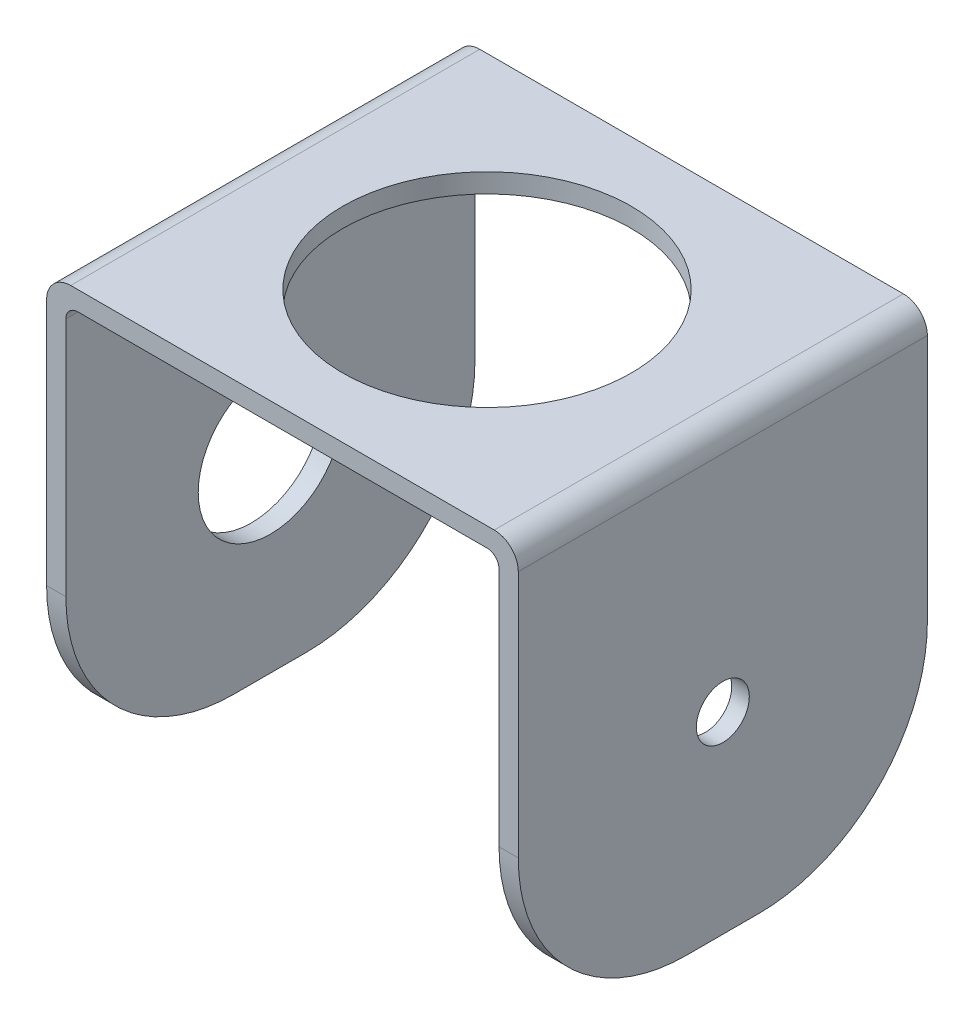
ISO-10303-21;
HEADER;
FILE_DESCRIPTION(('STEP AP214'),'2;1');
FILE_NAME('part.step','',(''),(''),'','','');
FILE_SCHEMA(('AUTOMOTIVE_DESIGN { 1 0 10303 214 1 1 1 1 }'));
ENDSEC;
DATA;
#1=APPLICATION_CONTEXT('core data for automotive mechanical design processes');
#2=APPLICATION_PROTOCOL_DEFINITION('international standard','automotive_design',2000,#1);
#3=PRODUCT_CONTEXT('',#1,'mechanical');
#4=PRODUCT('Part','Part','',(#3));
#5=PRODUCT_RELATED_PRODUCT_CATEGORY('part','',(#4));
#6=PRODUCT_DEFINITION_FORMATION('','',#4);
#7=PRODUCT_DEFINITION_CONTEXT('part definition',#1,'design');
#8=PRODUCT_DEFINITION('design','',#6,#7);
#9=PRODUCT_DEFINITION_SHAPE('','',#8);
#10=(LENGTH_UNIT() NAMED_UNIT(*) SI_UNIT(.MILLI.,.METRE.));
#11=(NAMED_UNIT(*) PLANE_ANGLE_UNIT() SI_UNIT($,.RADIAN.));
#12=(NAMED_UNIT(*) SI_UNIT($,.STERADIAN.) SOLID_ANGLE_UNIT());
#13=UNCERTAINTY_MEASURE_WITH_UNIT(LENGTH_MEASURE(1.E-05),#10,'distance_accuracy_value','');
#14=(GEOMETRIC_REPRESENTATION_CONTEXT(3) GLOBAL_UNCERTAINTY_ASSIGNED_CONTEXT((#13)) GLOBAL_UNIT_ASSIGNED_CONTEXT((#10,
#11,#12)) REPRESENTATION_CONTEXT('',''));
#15=CARTESIAN_POINT('',(0.,0.,0.));
#16=DIRECTION('',(0.,0.,1.));
#17=DIRECTION('',(1.,0.,0.));
#18=AXIS2_PLACEMENT_3D('',#15,#16,#17);
#19=CARTESIAN_POINT('',(-188.,-95.,85.));
#20=DIRECTION('',(1.,0.,0.));
#21=DIRECTION('',(0.,1.,0.));
#22=AXIS2_PLACEMENT_3D('',#19,#20,#21);
#23=CYLINDRICAL_SURFACE('',#22,11.);
#24=CARTESIAN_POINT('',(8.00000000000001,-95.,85.));
#25=DIRECTION('',(-1.,0.,0.));
#26=DIRECTION('',(0.,-1.,0.));
#27=AXIS2_PLACEMENT_3D('',#24,#25,#26);
#28=CIRCLE('',#27,11.);
#29=CARTESIAN_POINT('',(8.00000000000001,-106.,85.));
#30=VERTEX_POINT('',#29);
#31=EDGE_CURVE('E470',#30,#30,#28,.T.);
#32=ORIENTED_EDGE('',*,*,#31,.F.);
#33=EDGE_LOOP('',(#32));
#34=FACE_BOUND('',#33,.T.);
#35=CARTESIAN_POINT('',(0.700000000000006,-95.,85.));
#36=DIRECTION('',(-1.,0.,0.));
#37=DIRECTION('',(0.,-1.,0.));
#38=AXIS2_PLACEMENT_3D('',#35,#36,#37);
#39=CIRCLE('',#38,11.);
#40=CARTESIAN_POINT('',(0.700000000000008,-106.,85.));
#41=VERTEX_POINT('',#40);
#42=EDGE_CURVE('E38',#41,#41,#39,.F.);
#43=ORIENTED_EDGE('',*,*,#42,.F.);
#44=EDGE_LOOP('',(#43));
#45=FACE_BOUND('',#44,.T.);
#46=ADVANCED_FACE('F34',(#34,#45),#23,.F.);
#47=CARTESIAN_POINT('',(-180.,0.,170.));
#48=DIRECTION('',(-1.,0.,0.));
#49=DIRECTION('',(0.,0.,1.));
#50=AXIS2_PLACEMENT_3D('',#47,#48,#49);
#51=PLANE('',#50);
#52=CARTESIAN_POINT('',(-180.,-95.,85.));
#53=DIRECTION('',(-1.,0.,0.));
#54=DIRECTION('',(0.,0.,1.));
#55=AXIS2_PLACEMENT_3D('',#52,#53,#54);
#56=CIRCLE('',#55,30.);
#57=CARTESIAN_POINT('',(-180.,-95.,115.));
#58=VERTEX_POINT('',#57);
#59=EDGE_CURVE('E467',#58,#58,#56,.T.);
#60=ORIENTED_EDGE('',*,*,#59,.T.);
#61=EDGE_LOOP('',(#60));
#62=FACE_BOUND('',#61,.T.);
#63=DIRECTION('',(0.,1.,0.));
#64=VECTOR('',#63,1.);
#65=CARTESIAN_POINT('',(-180.,0.,0.));
#66=LINE('',#65,#64);
#67=CARTESIAN_POINT('',(-180.,-105.,0.));
#68=VERTEX_POINT('',#67);
#69=CARTESIAN_POINT('',(-180.,-5.,0.));
#70=VERTEX_POINT('',#69);
#71=EDGE_CURVE('E195',#68,#70,#66,.T.);
#72=ORIENTED_EDGE('',*,*,#71,.T.);
#73=DIRECTION('',(0.,0.,-1.));
#74=VECTOR('',#73,1.);
#75=CARTESIAN_POINT('',(-180.,-5.,170.));
#76=LINE('',#75,#74);
#77=CARTESIAN_POINT('',(-180.,-5.,170.));
#78=VERTEX_POINT('',#77);
#79=EDGE_CURVE('E175',#70,#78,#76,.F.);
#80=ORIENTED_EDGE('',*,*,#79,.T.);
#81=DIRECTION('',(0.,1.,0.));
#82=VECTOR('',#81,1.);
#83=CARTESIAN_POINT('',(-180.,0.,170.));
#84=LINE('',#83,#82);
#85=CARTESIAN_POINT('',(-180.,-105.,170.));
#86=VERTEX_POINT('',#85);
#87=EDGE_CURVE('E166',#86,#78,#84,.T.);
#88=ORIENTED_EDGE('',*,*,#87,.F.);
#89=CARTESIAN_POINT('',(-180.,-105.,100.));
#90=DIRECTION('',(-1.,0.,0.));
#91=DIRECTION('',(0.,0.,1.));
#92=AXIS2_PLACEMENT_3D('',#89,#90,#91);
#93=CIRCLE('',#92,70.);
#94=CARTESIAN_POINT('',(-180.,-175.,100.));
#95=VERTEX_POINT('',#94);
#96=EDGE_CURVE('E151',#86,#95,#93,.F.);
#97=ORIENTED_EDGE('',*,*,#96,.T.);
#98=DIRECTION('',(0.,0.,-1.));
#99=VECTOR('',#98,1.);
#100=CARTESIAN_POINT('',(-180.,-175.,170.));
#101=LINE('',#100,#99);
#102=CARTESIAN_POINT('',(-180.,-175.,70.));
#103=VERTEX_POINT('',#102);
#104=EDGE_CURVE('E194',#95,#103,#101,.T.);
#105=ORIENTED_EDGE('',*,*,#104,.T.);
#106=CARTESIAN_POINT('',(-180.,-105.,70.));
#107=DIRECTION('',(-1.,0.,0.));
#108=DIRECTION('',(0.,0.,1.));
#109=AXIS2_PLACEMENT_3D('',#106,#107,#108);
#110=CIRCLE('',#109,70.);
#111=EDGE_CURVE('E162',#103,#68,#110,.F.);
#112=ORIENTED_EDGE('',*,*,#111,.T.);
#113=EDGE_LOOP('',(#72,#80,#88,#97,#105,#112));
#114=FACE_BOUND('',#113,.T.);
#115=ADVANCED_FACE('F173',(#62,#114),#51,.F.);
#116=CARTESIAN_POINT('',(-180.,0.,170.));
#117=DIRECTION('',(0.,1.,0.));
#118=DIRECTION('',(0.,0.,1.));
#119=AXIS2_PLACEMENT_3D('',#116,#117,#118);
#120=PLANE('',#119);
#121=CARTESIAN_POINT('',(-90.,0.,85.));
#122=DIRECTION('',(0.,1.,0.));
#123=DIRECTION('',(0.,0.,1.));
#124=AXIS2_PLACEMENT_3D('',#121,#122,#123);
#125=CIRCLE('',#124,60.);
#126=CARTESIAN_POINT('',(-150.,0.,85.));
#127=VERTEX_POINT('',#126);
#128=EDGE_CURVE('E185',#127,#127,#125,.T.);
#129=ORIENTED_EDGE('',*,*,#128,.T.);
#130=EDGE_LOOP('',(#129));
#131=FACE_BOUND('',#130,.T.);
#132=DIRECTION('',(1.,0.,0.));
#133=VECTOR('',#132,1.);
#134=CARTESIAN_POINT('',(-180.,0.,170.));
#135=LINE('',#134,#133);
#136=CARTESIAN_POINT('',(-175.,0.,170.));
#137=VERTEX_POINT('',#136);
#138=CARTESIAN_POINT('',(-5.00000000000006,0.,170.));
#139=VERTEX_POINT('',#138);
#140=EDGE_CURVE('E176',#137,#139,#135,.T.);
#141=ORIENTED_EDGE('',*,*,#140,.F.);
#142=DIRECTION('',(0.,0.,-1.));
#143=VECTOR('',#142,1.);
#144=CARTESIAN_POINT('',(-175.,0.,0.));
#145=LINE('',#144,#143);
#146=CARTESIAN_POINT('',(-175.,0.,0.));
#147=VERTEX_POINT('',#146);
#148=EDGE_CURVE('E248',#137,#147,#145,.T.);
#149=ORIENTED_EDGE('',*,*,#148,.T.);
#150=DIRECTION('',(1.,0.,0.));
#151=VECTOR('',#150,1.);
#152=CARTESIAN_POINT('',(-180.,0.,0.));
#153=LINE('',#152,#151);
#154=CARTESIAN_POINT('',(-5.00000000000006,0.,0.));
#155=VERTEX_POINT('',#154);
#156=EDGE_CURVE('E197',#147,#155,#153,.T.);
#157=ORIENTED_EDGE('',*,*,#156,.T.);
#158=DIRECTION('',(0.,0.,-1.));
#159=VECTOR('',#158,1.);
#160=CARTESIAN_POINT('',(-5.,0.,170.));
#161=LINE('',#160,#159);
#162=EDGE_CURVE('E246',#155,#139,#161,.F.);
#163=ORIENTED_EDGE('',*,*,#162,.T.);
#164=EDGE_LOOP('',(#141,#149,#157,#163));
#165=FACE_BOUND('',#164,.T.);
#166=ADVANCED_FACE('F313',(#131,#165),#120,.F.);
#167=CARTESIAN_POINT('',(0.,0.,170.));
#168=DIRECTION('',(1.,0.,0.));
#169=DIRECTION('',(0.,1.,0.));
#170=AXIS2_PLACEMENT_3D('',#167,#168,#169);
#171=PLANE('',#170);
#172=CARTESIAN_POINT('',(0.,-95.,85.));
#173=DIRECTION('',(-1.,0.,0.));
#174=DIRECTION('',(0.,-1.,0.));
#175=AXIS2_PLACEMENT_3D('',#172,#173,#174);
#176=CIRCLE('',#175,13.);
#177=CARTESIAN_POINT('',(0.,-108.,85.));
#178=VERTEX_POINT('',#177);
#179=EDGE_CURVE('E460',#178,#178,#176,.T.);
#180=ORIENTED_EDGE('',*,*,#179,.F.);
#181=EDGE_LOOP('',(#180));
#182=FACE_BOUND('',#181,.T.);
#183=DIRECTION('',(0.,-1.,0.));
#184=VECTOR('',#183,1.);
#185=CARTESIAN_POINT('',(0.,0.,170.));
#186=LINE('',#185,#184);
#187=CARTESIAN_POINT('',(0.,-5.,170.));
#188=VERTEX_POINT('',#187);
#189=CARTESIAN_POINT('',(0.,-105.,170.));
#190=VERTEX_POINT('',#189);
#191=EDGE_CURVE('E180',#188,#190,#186,.T.);
#192=ORIENTED_EDGE('',*,*,#191,.F.);
#193=DIRECTION('',(0.,0.,-1.));
#194=VECTOR('',#193,1.);
#195=CARTESIAN_POINT('',(0.,-5.,0.));
#196=LINE('',#195,#194);
#197=CARTESIAN_POINT('',(0.,-5.,0.));
#198=VERTEX_POINT('',#197);
#199=EDGE_CURVE('E252',#188,#198,#196,.T.);
#200=ORIENTED_EDGE('',*,*,#199,.T.);
#201=DIRECTION('',(0.,-1.,0.));
#202=VECTOR('',#201,1.);
#203=CARTESIAN_POINT('',(0.,0.,0.));
#204=LINE('',#203,#202);
#205=CARTESIAN_POINT('',(0.,-105.,0.));
#206=VERTEX_POINT('',#205);
#207=EDGE_CURVE('E200',#198,#206,#204,.T.);
#208=ORIENTED_EDGE('',*,*,#207,.T.);
#209=CARTESIAN_POINT('',(0.,-105.,70.));
#210=DIRECTION('',(1.,0.,0.));
#211=DIRECTION('',(0.,1.,0.));
#212=AXIS2_PLACEMENT_3D('',#209,#210,#211);
#213=CIRCLE('',#212,70.);
#214=CARTESIAN_POINT('',(0.,-175.,70.));
#215=VERTEX_POINT('',#214);
#216=EDGE_CURVE('E244',#206,#215,#213,.F.);
#217=ORIENTED_EDGE('',*,*,#216,.T.);
#218=DIRECTION('',(0.,0.,-1.));
#219=VECTOR('',#218,1.);
#220=CARTESIAN_POINT('',(0.,-175.,170.));
#221=LINE('',#220,#219);
#222=CARTESIAN_POINT('',(0.,-175.,100.));
#223=VERTEX_POINT('',#222);
#224=EDGE_CURVE('E213',#223,#215,#221,.T.);
#225=ORIENTED_EDGE('',*,*,#224,.F.);
#226=CARTESIAN_POINT('',(0.,-105.,100.));
#227=DIRECTION('',(1.,0.,0.));
#228=DIRECTION('',(0.,1.,0.));
#229=AXIS2_PLACEMENT_3D('',#226,#227,#228);
#230=CIRCLE('',#229,70.);
#231=EDGE_CURVE('E241',#223,#190,#230,.F.);
#232=ORIENTED_EDGE('',*,*,#231,.T.);
#233=EDGE_LOOP('',(#192,#200,#208,#217,#225,#232));
#234=FACE_BOUND('',#233,.T.);
#235=ADVANCED_FACE('F300',(#182,#234),#171,.F.);
#236=CARTESIAN_POINT('',(0.,-175.,170.));
#237=DIRECTION('',(0.,1.,0.));
#238=DIRECTION('',(0.,0.,1.));
#239=AXIS2_PLACEMENT_3D('',#236,#237,#238);
#240=PLANE('',#239);
#241=ORIENTED_EDGE('',*,*,#224,.T.);
#242=DIRECTION('',(1.,0.,0.));
#243=VECTOR('',#242,1.);
#244=CARTESIAN_POINT('',(8.00000000000002,-175.,70.));
#245=LINE('',#244,#243);
#246=CARTESIAN_POINT('',(8.00000000000002,-175.,70.));
#247=VERTEX_POINT('',#246);
#248=EDGE_CURVE('E234',#215,#247,#245,.T.);
#249=ORIENTED_EDGE('',*,*,#248,.T.);
#250=DIRECTION('',(0.,0.,-1.));
#251=VECTOR('',#250,1.);
#252=CARTESIAN_POINT('',(8.00000000000002,-175.,170.));
#253=LINE('',#252,#251);
#254=CARTESIAN_POINT('',(8.00000000000002,-175.,100.));
#255=VERTEX_POINT('',#254);
#256=EDGE_CURVE('E210',#255,#247,#253,.T.);
#257=ORIENTED_EDGE('',*,*,#256,.F.);
#258=DIRECTION('',(1.,0.,0.));
#259=VECTOR('',#258,1.);
#260=CARTESIAN_POINT('',(0.,-175.,100.));
#261=LINE('',#260,#259);
#262=EDGE_CURVE('E232',#255,#223,#261,.F.);
#263=ORIENTED_EDGE('',*,*,#262,.T.);
#264=EDGE_LOOP('',(#241,#249,#257,#263));
#265=FACE_BOUND('',#264,.T.);
#266=ADVANCED_FACE('F294',(#265),#240,.F.);
#267=CARTESIAN_POINT('',(8.00000000000002,-175.,170.));
#268=DIRECTION('',(-1.,0.,0.));
#269=DIRECTION('',(0.,-1.,0.));
#270=AXIS2_PLACEMENT_3D('',#267,#268,#269);
#271=PLANE('',#270);
#272=ORIENTED_EDGE('',*,*,#31,.T.);
#273=EDGE_LOOP('',(#272));
#274=FACE_BOUND('',#273,.T.);
#275=DIRECTION('',(0.,1.,0.));
#276=VECTOR('',#275,1.);
#277=CARTESIAN_POINT('',(8.00000000000002,-175.,0.));
#278=LINE('',#277,#276);
#279=CARTESIAN_POINT('',(8.00000000000002,-105.,0.));
#280=VERTEX_POINT('',#279);
#281=CARTESIAN_POINT('',(8.00000000000001,-1.99999999999997,0.));
#282=VERTEX_POINT('',#281);
#283=EDGE_CURVE('E202',#280,#282,#278,.T.);
#284=ORIENTED_EDGE('',*,*,#283,.T.);
#285=DIRECTION('',(0.,0.,-1.));
#286=VECTOR('',#285,1.);
#287=CARTESIAN_POINT('',(8.00000000000001,-1.99999999999997,170.));
#288=LINE('',#287,#286);
#289=CARTESIAN_POINT('',(8.00000000000001,-1.99999999999997,170.));
#290=VERTEX_POINT('',#289);
#291=EDGE_CURVE('E58',#282,#290,#288,.F.);
#292=ORIENTED_EDGE('',*,*,#291,.T.);
#293=DIRECTION('',(0.,1.,0.));
#294=VECTOR('',#293,1.);
#295=CARTESIAN_POINT('',(8.00000000000002,-175.,170.));
#296=LINE('',#295,#294);
#297=CARTESIAN_POINT('',(8.00000000000002,-105.,170.));
#298=VERTEX_POINT('',#297);
#299=EDGE_CURVE('E189',#298,#290,#296,.T.);
#300=ORIENTED_EDGE('',*,*,#299,.F.);
#301=CARTESIAN_POINT('',(8.00000000000002,-105.,100.));
#302=DIRECTION('',(-1.,0.,0.));
#303=DIRECTION('',(0.,-1.,0.));
#304=AXIS2_PLACEMENT_3D('',#301,#302,#303);
#305=CIRCLE('',#304,70.);
#306=EDGE_CURVE('E237',#298,#255,#305,.F.);
#307=ORIENTED_EDGE('',*,*,#306,.T.);
#308=ORIENTED_EDGE('',*,*,#256,.T.);
#309=CARTESIAN_POINT('',(8.00000000000002,-105.,70.));
#310=DIRECTION('',(-1.,0.,0.));
#311=DIRECTION('',(0.,-1.,0.));
#312=AXIS2_PLACEMENT_3D('',#309,#310,#311);
#313=CIRCLE('',#312,70.);
#314=EDGE_CURVE('E239',#247,#280,#313,.F.);
#315=ORIENTED_EDGE('',*,*,#314,.T.);
#316=EDGE_LOOP('',(#284,#292,#300,#307,#308,#315));
#317=FACE_BOUND('',#316,.T.);
#318=ADVANCED_FACE('F287',(#274,#317),#271,.F.);
#319=CARTESIAN_POINT('',(-180.,7.99999999999998,170.));
#320=DIRECTION('',(0.,-1.,0.));
#321=DIRECTION('',(1.,0.,0.));
#322=AXIS2_PLACEMENT_3D('',#319,#320,#321);
#323=PLANE('',#322);
#324=CARTESIAN_POINT('',(-90.,8.00000000000001,85.));
#325=DIRECTION('',(0.,1.,0.));
#326=DIRECTION('',(-1.,0.,0.));
#327=AXIS2_PLACEMENT_3D('',#324,#325,#326);
#328=CIRCLE('',#327,60.);
#329=CARTESIAN_POINT('',(-150.,8.00000000000004,85.));
#330=VERTEX_POINT('',#329);
#331=EDGE_CURVE('E472',#330,#330,#328,.T.);
#332=ORIENTED_EDGE('',*,*,#331,.F.);
#333=EDGE_LOOP('',(#332));
#334=FACE_BOUND('',#333,.T.);
#335=DIRECTION('',(-1.,0.,0.));
#336=VECTOR('',#335,1.);
#337=CARTESIAN_POINT('',(8.00000000000001,8.00000000000001,170.));
#338=LINE('',#337,#336);
#339=CARTESIAN_POINT('',(-1.99999999999998,8.00000000000001,170.));
#340=VERTEX_POINT('',#339);
#341=CARTESIAN_POINT('',(-178.,7.99999999999998,170.));
#342=VERTEX_POINT('',#341);
#343=EDGE_CURVE('E191',#340,#342,#338,.T.);
#344=ORIENTED_EDGE('',*,*,#343,.F.);
#345=DIRECTION('',(0.,0.,-1.));
#346=VECTOR('',#345,1.);
#347=CARTESIAN_POINT('',(-1.99999999999997,8.00000000000002,170.));
#348=LINE('',#347,#346);
#349=CARTESIAN_POINT('',(-1.99999999999997,8.00000000000002,0.));
#350=VERTEX_POINT('',#349);
#351=EDGE_CURVE('E265',#340,#350,#348,.T.);
#352=ORIENTED_EDGE('',*,*,#351,.T.);
#353=DIRECTION('',(-1.,0.,0.));
#354=VECTOR('',#353,1.);
#355=CARTESIAN_POINT('',(-180.,7.99999999999998,0.));
#356=LINE('',#355,#354);
#357=CARTESIAN_POINT('',(-178.,7.99999999999998,0.));
#358=VERTEX_POINT('',#357);
#359=EDGE_CURVE('E182',#350,#358,#356,.T.);
#360=ORIENTED_EDGE('',*,*,#359,.T.);
#361=DIRECTION('',(0.,0.,-1.));
#362=VECTOR('',#361,1.);
#363=CARTESIAN_POINT('',(-178.,7.99999999999998,170.));
#364=LINE('',#363,#362);
#365=EDGE_CURVE('E263',#358,#342,#364,.F.);
#366=ORIENTED_EDGE('',*,*,#365,.T.);
#367=EDGE_LOOP('',(#344,#352,#360,#366));
#368=FACE_BOUND('',#367,.T.);
#369=ADVANCED_FACE('F279',(#334,#368),#323,.F.);
#370=CARTESIAN_POINT('',(-188.,7.99999999999998,170.));
#371=DIRECTION('',(1.,0.,0.));
#372=DIRECTION('',(0.,1.,0.));
#373=AXIS2_PLACEMENT_3D('',#370,#371,#372);
#374=PLANE('',#373);
#375=CARTESIAN_POINT('',(-188.,-95.,85.));
#376=DIRECTION('',(-1.,0.,0.));
#377=DIRECTION('',(0.,-1.,0.));
#378=AXIS2_PLACEMENT_3D('',#375,#376,#377);
#379=CIRCLE('',#378,30.);
#380=CARTESIAN_POINT('',(-188.,-125.,85.));
#381=VERTEX_POINT('',#380);
#382=EDGE_CURVE('E464',#381,#381,#379,.T.);
#383=ORIENTED_EDGE('',*,*,#382,.F.);
#384=EDGE_LOOP('',(#383));
#385=FACE_BOUND('',#384,.T.);
#386=DIRECTION('',(0.,-1.,0.));
#387=VECTOR('',#386,1.);
#388=CARTESIAN_POINT('',(-188.,7.99999999999998,170.));
#389=LINE('',#388,#387);
#390=CARTESIAN_POINT('',(-188.,-2.00000000000002,170.));
#391=VERTEX_POINT('',#390);
#392=CARTESIAN_POINT('',(-188.,-105.,170.));
#393=VERTEX_POINT('',#392);
#394=EDGE_CURVE('E168',#391,#393,#389,.T.);
#395=ORIENTED_EDGE('',*,*,#394,.F.);
#396=DIRECTION('',(0.,0.,-1.));
#397=VECTOR('',#396,1.);
#398=CARTESIAN_POINT('',(-188.,-2.00000000000002,170.));
#399=LINE('',#398,#397);
#400=CARTESIAN_POINT('',(-188.,-2.00000000000002,0.));
#401=VERTEX_POINT('',#400);
#402=EDGE_CURVE('E11',#391,#401,#399,.T.);
#403=ORIENTED_EDGE('',*,*,#402,.T.);
#404=DIRECTION('',(0.,-1.,0.));
#405=VECTOR('',#404,1.);
#406=CARTESIAN_POINT('',(-188.,7.99999999999998,0.));
#407=LINE('',#406,#405);
#408=CARTESIAN_POINT('',(-188.,-105.,0.));
#409=VERTEX_POINT('',#408);
#410=EDGE_CURVE('E177',#401,#409,#407,.T.);
#411=ORIENTED_EDGE('',*,*,#410,.T.);
#412=CARTESIAN_POINT('',(-188.,-105.,70.));
#413=DIRECTION('',(1.,0.,0.));
#414=DIRECTION('',(0.,1.,0.));
#415=AXIS2_PLACEMENT_3D('',#412,#413,#414);
#416=CIRCLE('',#415,70.);
#417=CARTESIAN_POINT('',(-188.,-175.,70.));
#418=VERTEX_POINT('',#417);
#419=EDGE_CURVE('E222',#409,#418,#416,.F.);
#420=ORIENTED_EDGE('',*,*,#419,.T.);
#421=DIRECTION('',(0.,0.,-1.));
#422=VECTOR('',#421,1.);
#423=CARTESIAN_POINT('',(-188.,-175.,170.));
#424=LINE('',#423,#422);
#425=CARTESIAN_POINT('',(-188.,-175.,100.));
#426=VERTEX_POINT('',#425);
#427=EDGE_CURVE('E207',#426,#418,#424,.T.);
#428=ORIENTED_EDGE('',*,*,#427,.F.);
#429=CARTESIAN_POINT('',(-188.,-105.,100.));
#430=DIRECTION('',(1.,0.,0.));
#431=DIRECTION('',(0.,1.,0.));
#432=AXIS2_PLACEMENT_3D('',#429,#430,#431);
#433=CIRCLE('',#432,70.);
#434=EDGE_CURVE('E224',#426,#393,#433,.F.);
#435=ORIENTED_EDGE('',*,*,#434,.T.);
#436=EDGE_LOOP('',(#395,#403,#411,#420,#428,#435));
#437=FACE_BOUND('',#436,.T.);
#438=ADVANCED_FACE('F327',(#385,#437),#374,.F.);
#439=CARTESIAN_POINT('',(-180.,-175.,170.));
#440=DIRECTION('',(0.,1.,0.));
#441=DIRECTION('',(0.,0.,1.));
#442=AXIS2_PLACEMENT_3D('',#439,#440,#441);
#443=PLANE('',#442);
#444=ORIENTED_EDGE('',*,*,#104,.F.);
#445=DIRECTION('',(1.,0.,0.));
#446=VECTOR('',#445,1.);
#447=CARTESIAN_POINT('',(-180.,-175.,100.));
#448=LINE('',#447,#446);
#449=EDGE_CURVE('E156',#95,#426,#448,.F.);
#450=ORIENTED_EDGE('',*,*,#449,.T.);
#451=ORIENTED_EDGE('',*,*,#427,.T.);
#452=DIRECTION('',(1.,0.,0.));
#453=VECTOR('',#452,1.);
#454=CARTESIAN_POINT('',(-180.,-175.,70.));
#455=LINE('',#454,#453);
#456=EDGE_CURVE('E161',#418,#103,#455,.T.);
#457=ORIENTED_EDGE('',*,*,#456,.T.);
#458=EDGE_LOOP('',(#444,#450,#451,#457));
#459=FACE_BOUND('',#458,.T.);
#460=ADVANCED_FACE('F324',(#459),#443,.F.);
#461=CARTESIAN_POINT('',(0.,0.,170.));
#462=DIRECTION('',(0.,0.,-1.));
#463=DIRECTION('',(-1.,0.,0.));
#464=AXIS2_PLACEMENT_3D('',#461,#462,#463);
#465=PLANE('',#464);
#466=ORIENTED_EDGE('',*,*,#299,.T.);
#467=CARTESIAN_POINT('',(-1.99999999999997,-1.99999999999998,170.));
#468=DIRECTION('',(0.,0.,-1.));
#469=DIRECTION('',(-1.,0.,0.));
#470=AXIS2_PLACEMENT_3D('',#467,#468,#469);
#471=CIRCLE('',#470,10.);
#472=EDGE_CURVE('E43',#290,#340,#471,.F.);
#473=ORIENTED_EDGE('',*,*,#472,.T.);
#474=ORIENTED_EDGE('',*,*,#343,.T.);
#475=CARTESIAN_POINT('',(-178.,-2.00000000000002,170.));
#476=DIRECTION('',(0.,0.,-1.));
#477=DIRECTION('',(-1.,0.,0.));
#478=AXIS2_PLACEMENT_3D('',#475,#476,#477);
#479=CIRCLE('',#478,10.);
#480=EDGE_CURVE('E50',#342,#391,#479,.F.);
#481=ORIENTED_EDGE('',*,*,#480,.T.);
#482=ORIENTED_EDGE('',*,*,#394,.T.);
#483=DIRECTION('',(1.,0.,0.));
#484=VECTOR('',#483,1.);
#485=CARTESIAN_POINT('',(0.,-105.,170.));
#486=LINE('',#485,#484);
#487=EDGE_CURVE('E155',#393,#86,#486,.T.);
#488=ORIENTED_EDGE('',*,*,#487,.T.);
#489=ORIENTED_EDGE('',*,*,#87,.T.);
#490=CARTESIAN_POINT('',(-175.,-5.,170.));
#491=DIRECTION('',(0.,0.,-1.));
#492=DIRECTION('',(-1.,0.,0.));
#493=AXIS2_PLACEMENT_3D('',#490,#491,#492);
#494=CIRCLE('',#493,5.);
#495=EDGE_CURVE('E257',#78,#137,#494,.T.);
#496=ORIENTED_EDGE('',*,*,#495,.T.);
#497=ORIENTED_EDGE('',*,*,#140,.T.);
#498=CARTESIAN_POINT('',(-5.,-5.,170.));
#499=DIRECTION('',(0.,0.,-1.));
#500=DIRECTION('',(-1.,0.,0.));
#501=AXIS2_PLACEMENT_3D('',#498,#499,#500);
#502=CIRCLE('',#501,5.);
#503=EDGE_CURVE('E261',#139,#188,#502,.T.);
#504=ORIENTED_EDGE('',*,*,#503,.T.);
#505=ORIENTED_EDGE('',*,*,#191,.T.);
#506=DIRECTION('',(1.,0.,0.));
#507=VECTOR('',#506,1.);
#508=CARTESIAN_POINT('',(0.,-105.,170.));
#509=LINE('',#508,#507);
#510=EDGE_CURVE('E170',#190,#298,#509,.T.);
#511=ORIENTED_EDGE('',*,*,#510,.T.);
#512=EDGE_LOOP('',(#466,#473,#474,#481,#482,#488,#489,#496,#497,#504,#505,#511));
#513=FACE_BOUND('',#512,.T.);
#514=ADVANCED_FACE('F165',(#513),#465,.F.);
#515=CARTESIAN_POINT('',(0.,0.,0.));
#516=DIRECTION('',(0.,0.,-1.));
#517=DIRECTION('',(-1.,0.,0.));
#518=AXIS2_PLACEMENT_3D('',#515,#516,#517);
#519=PLANE('',#518);
#520=ORIENTED_EDGE('',*,*,#359,.F.);
#521=CARTESIAN_POINT('',(-1.99999999999997,-1.99999999999998,0.));
#522=DIRECTION('',(0.,0.,-1.));
#523=DIRECTION('',(-1.,0.,0.));
#524=AXIS2_PLACEMENT_3D('',#521,#522,#523);
#525=CIRCLE('',#524,10.);
#526=EDGE_CURVE('E270',#350,#282,#525,.T.);
#527=ORIENTED_EDGE('',*,*,#526,.T.);
#528=ORIENTED_EDGE('',*,*,#283,.F.);
#529=DIRECTION('',(1.,0.,0.));
#530=VECTOR('',#529,1.);
#531=CARTESIAN_POINT('',(0.,-105.,0.));
#532=LINE('',#531,#530);
#533=EDGE_CURVE('E226',#280,#206,#532,.F.);
#534=ORIENTED_EDGE('',*,*,#533,.T.);
#535=ORIENTED_EDGE('',*,*,#207,.F.);
#536=CARTESIAN_POINT('',(-5.,-5.,0.));
#537=DIRECTION('',(0.,0.,-1.));
#538=DIRECTION('',(-1.,0.,0.));
#539=AXIS2_PLACEMENT_3D('',#536,#537,#538);
#540=CIRCLE('',#539,5.);
#541=EDGE_CURVE('E259',#198,#155,#540,.F.);
#542=ORIENTED_EDGE('',*,*,#541,.T.);
#543=ORIENTED_EDGE('',*,*,#156,.F.);
#544=CARTESIAN_POINT('',(-175.,-5.,0.));
#545=DIRECTION('',(0.,0.,-1.));
#546=DIRECTION('',(-1.,0.,0.));
#547=AXIS2_PLACEMENT_3D('',#544,#545,#546);
#548=CIRCLE('',#547,5.);
#549=EDGE_CURVE('E255',#147,#70,#548,.F.);
#550=ORIENTED_EDGE('',*,*,#549,.T.);
#551=ORIENTED_EDGE('',*,*,#71,.F.);
#552=DIRECTION('',(1.,0.,0.));
#553=VECTOR('',#552,1.);
#554=CARTESIAN_POINT('',(-188.,-105.,0.));
#555=LINE('',#554,#553);
#556=EDGE_CURVE('E229',#68,#409,#555,.F.);
#557=ORIENTED_EDGE('',*,*,#556,.T.);
#558=ORIENTED_EDGE('',*,*,#410,.F.);
#559=CARTESIAN_POINT('',(-178.,-2.00000000000002,0.));
#560=DIRECTION('',(0.,0.,-1.));
#561=DIRECTION('',(-1.,0.,0.));
#562=AXIS2_PLACEMENT_3D('',#559,#560,#561);
#563=CIRCLE('',#562,10.);
#564=EDGE_CURVE('E268',#401,#358,#563,.T.);
#565=ORIENTED_EDGE('',*,*,#564,.T.);
#566=EDGE_LOOP('',(#520,#527,#528,#534,#535,#542,#543,#550,#551,#557,#558,#565));
#567=FACE_BOUND('',#566,.T.);
#568=ADVANCED_FACE('F285',(#567),#519,.T.);
#569=CARTESIAN_POINT('',(-90.,-172.,85.));
#570=DIRECTION('',(0.,1.,0.));
#571=DIRECTION('',(-1.,0.,0.));
#572=AXIS2_PLACEMENT_3D('',#569,#570,#571);
#573=CYLINDRICAL_SURFACE('',#572,60.);
#574=CARTESIAN_POINT('',(-150.,8.00000000000004,85.));
#575=CARTESIAN_POINT('',(-150.,7.9166666666667,85.));
#576=CARTESIAN_POINT('',(-150.,7.83333333333337,85.));
#577=CARTESIAN_POINT('',(-150.,7.6666666666667,85.));
#578=CARTESIAN_POINT('',(-150.,7.58333333333337,85.));
#579=CARTESIAN_POINT('',(-150.,7.4166666666667,85.));
#580=CARTESIAN_POINT('',(-150.,7.33333333333337,85.));
#581=CARTESIAN_POINT('',(-150.,7.1666666666667,85.));
#582=CARTESIAN_POINT('',(-150.,7.08333333333337,85.));
#583=CARTESIAN_POINT('',(-150.,6.9166666666667,85.));
#584=CARTESIAN_POINT('',(-150.,6.83333333333337,85.));
#585=CARTESIAN_POINT('',(-150.,6.6666666666667,85.));
#586=CARTESIAN_POINT('',(-150.,6.58333333333337,85.));
#587=CARTESIAN_POINT('',(-150.,6.4166666666667,85.));
#588=CARTESIAN_POINT('',(-150.,6.33333333333337,85.));
#589=CARTESIAN_POINT('',(-150.,6.1666666666667,85.));
#590=CARTESIAN_POINT('',(-150.,6.08333333333337,85.));
#591=CARTESIAN_POINT('',(-150.,5.91666666666669,85.));
#592=CARTESIAN_POINT('',(-150.,5.83333333333335,85.));
#593=CARTESIAN_POINT('',(-150.,5.66666666666667,85.));
#594=CARTESIAN_POINT('',(-150.,5.58333333333334,85.));
#595=CARTESIAN_POINT('',(-150.,5.41666666666667,85.));
#596=CARTESIAN_POINT('',(-150.,5.33333333333334,85.));
#597=CARTESIAN_POINT('',(-150.,5.16666666666667,85.));
#598=CARTESIAN_POINT('',(-150.,5.08333333333334,85.));
#599=CARTESIAN_POINT('',(-150.,4.91666666666667,85.));
#600=CARTESIAN_POINT('',(-150.,4.83333333333334,85.));
#601=CARTESIAN_POINT('',(-150.,4.66666666666667,85.));
#602=CARTESIAN_POINT('',(-150.,4.58333333333334,85.));
#603=CARTESIAN_POINT('',(-150.,4.41666666666667,85.));
#604=CARTESIAN_POINT('',(-150.,4.33333333333334,85.));
#605=CARTESIAN_POINT('',(-150.,4.16666666666667,85.));
#606=CARTESIAN_POINT('',(-150.,4.08333333333334,85.));
#607=CARTESIAN_POINT('',(-150.,3.91666666666667,85.));
#608=CARTESIAN_POINT('',(-150.,3.83333333333334,85.));
#609=CARTESIAN_POINT('',(-150.,3.66666666666667,85.));
#610=CARTESIAN_POINT('',(-150.,3.58333333333334,85.));
#611=CARTESIAN_POINT('',(-150.,3.41666666666667,85.));
#612=CARTESIAN_POINT('',(-150.,3.33333333333334,85.));
#613=CARTESIAN_POINT('',(-150.,3.16666666666667,85.));
#614=CARTESIAN_POINT('',(-150.,3.08333333333334,85.));
#615=CARTESIAN_POINT('',(-150.,2.91666666666667,85.));
#616=CARTESIAN_POINT('',(-150.,2.83333333333334,85.));
#617=CARTESIAN_POINT('',(-150.,2.66666666666667,85.));
#618=CARTESIAN_POINT('',(-150.,2.58333333333334,85.));
#619=CARTESIAN_POINT('',(-150.,2.41666666666667,85.));
#620=CARTESIAN_POINT('',(-150.,2.33333333333334,85.));
#621=CARTESIAN_POINT('',(-150.,2.16666666666666,85.));
#622=CARTESIAN_POINT('',(-150.,2.08333333333332,85.));
#623=CARTESIAN_POINT('',(-150.,1.91666666666664,85.));
#624=CARTESIAN_POINT('',(-150.,1.83333333333331,85.));
#625=CARTESIAN_POINT('',(-150.,1.66666666666664,85.));
#626=CARTESIAN_POINT('',(-150.,1.58333333333331,85.));
#627=CARTESIAN_POINT('',(-150.,1.41666666666664,85.));
#628=CARTESIAN_POINT('',(-150.,1.33333333333331,85.));
#629=CARTESIAN_POINT('',(-150.,1.16666666666664,85.));
#630=CARTESIAN_POINT('',(-150.,1.08333333333331,85.));
#631=CARTESIAN_POINT('',(-150.,0.91666666666664,85.));
#632=CARTESIAN_POINT('',(-150.,0.833333333333306,85.));
#633=CARTESIAN_POINT('',(-150.,0.66666666666664,85.));
#634=CARTESIAN_POINT('',(-150.,0.583333333333306,85.));
#635=CARTESIAN_POINT('',(-150.,0.416666666666639,85.));
#636=CARTESIAN_POINT('',(-150.,0.333333333333306,85.));
#637=CARTESIAN_POINT('',(-150.,0.166666666666639,85.));
#638=CARTESIAN_POINT('',(-150.,0.0833333333333056,85.));
#639=CARTESIAN_POINT('',(-150.,0.,85.));
#640=B_SPLINE_CURVE_WITH_KNOTS('',3,(#574,#575,#576,#577,#578,#579,#580,#581,#582,#583,#584,
#585,#586,#587,#588,#589,#590,#591,#592,#593,#594,#595,#596,#597,#598,#599,#600,#601,#602,#603,
#604,#605,#606,#607,#608,#609,#610,#611,#612,#613,#614,#615,#616,#617,#618,#619,#620,#621,#622,
#623,#624,#625,#626,#627,#628,#629,#630,#631,#632,#633,#634,#635,#636,#637,#638,#639),
.UNSPECIFIED.,.F.,.F.,(4,2,2,2,2,2,2,2,2,2,2,2,2,2,2,2,2,2,2,2,2,2,2,2,2,2,2,2,2,2,2,2,4),(0.,
0.25,0.5,0.750000000000001,1.,1.25,1.5,1.75,2.,2.25000000000003,2.50000000000003,
2.75000000000003,3.00000000000003,3.25000000000003,3.50000000000003,3.75000000000003,
4.00000000000003,4.25000000000003,4.50000000000003,4.75000000000003,5.00000000000003,
5.25000000000003,5.50000000000003,5.75000000000003,6.00000000000006,6.25000000000006,
6.50000000000006,6.75000000000006,7.00000000000006,7.25000000000006,7.50000000000006,
7.75000000000006,8.00000000000006),.UNSPECIFIED.);
#641=EDGE_CURVE('BSEAM354',#330,#127,#640,.T.);
#642=ORIENTED_EDGE('',*,*,#331,.T.);
#643=ORIENTED_EDGE('',*,*,#128,.F.);
#644=ORIENTED_EDGE('',*,*,#641,.T.);
#645=ORIENTED_EDGE('',*,*,#641,.F.);
#646=EDGE_LOOP('',(#642,#644,#643,#645));
#647=FACE_BOUND('',#646,.T.);
#648=ADVANCED_FACE('F354',(#647),#573,.F.);
#649=CARTESIAN_POINT('',(0.,-105.,100.));
#650=DIRECTION('',(1.,0.,0.));
#651=DIRECTION('',(0.,0.,-1.));
#652=AXIS2_PLACEMENT_3D('',#649,#650,#651);
#653=CYLINDRICAL_SURFACE('',#652,70.);
#654=ORIENTED_EDGE('',*,*,#434,.F.);
#655=ORIENTED_EDGE('',*,*,#449,.F.);
#656=ORIENTED_EDGE('',*,*,#96,.F.);
#657=ORIENTED_EDGE('',*,*,#487,.F.);
#658=EDGE_LOOP('',(#654,#655,#656,#657));
#659=FACE_BOUND('',#658,.T.);
#660=ADVANCED_FACE('F154',(#659),#653,.T.);
#661=CARTESIAN_POINT('',(-180.,-105.,70.));
#662=DIRECTION('',(-1.,0.,0.));
#663=DIRECTION('',(0.,0.,1.));
#664=AXIS2_PLACEMENT_3D('',#661,#662,#663);
#665=CYLINDRICAL_SURFACE('',#664,70.);
#666=ORIENTED_EDGE('',*,*,#419,.F.);
#667=ORIENTED_EDGE('',*,*,#556,.F.);
#668=ORIENTED_EDGE('',*,*,#111,.F.);
#669=ORIENTED_EDGE('',*,*,#456,.F.);
#670=EDGE_LOOP('',(#666,#667,#668,#669));
#671=FACE_BOUND('',#670,.T.);
#672=ADVANCED_FACE('F322',(#671),#665,.T.);
#673=CARTESIAN_POINT('',(0.,-105.,70.));
#674=DIRECTION('',(-1.,0.,0.));
#675=DIRECTION('',(0.,0.,1.));
#676=AXIS2_PLACEMENT_3D('',#673,#674,#675);
#677=CYLINDRICAL_SURFACE('',#676,70.);
#678=ORIENTED_EDGE('',*,*,#216,.F.);
#679=ORIENTED_EDGE('',*,*,#533,.F.);
#680=ORIENTED_EDGE('',*,*,#314,.F.);
#681=ORIENTED_EDGE('',*,*,#248,.F.);
#682=EDGE_LOOP('',(#678,#679,#680,#681));
#683=FACE_BOUND('',#682,.T.);
#684=ADVANCED_FACE('F292',(#683),#677,.T.);
#685=CARTESIAN_POINT('',(0.,-105.,100.));
#686=DIRECTION('',(1.,0.,0.));
#687=DIRECTION('',(0.,0.,-1.));
#688=AXIS2_PLACEMENT_3D('',#685,#686,#687);
#689=CYLINDRICAL_SURFACE('',#688,70.);
#690=ORIENTED_EDGE('',*,*,#231,.F.);
#691=ORIENTED_EDGE('',*,*,#262,.F.);
#692=ORIENTED_EDGE('',*,*,#306,.F.);
#693=ORIENTED_EDGE('',*,*,#510,.F.);
#694=EDGE_LOOP('',(#690,#691,#692,#693));
#695=FACE_BOUND('',#694,.T.);
#696=ADVANCED_FACE('F303',(#695),#689,.T.);
#697=CARTESIAN_POINT('',(-175.,-5.,170.));
#698=DIRECTION('',(0.,0.,1.));
#699=DIRECTION('',(1.,0.,0.));
#700=AXIS2_PLACEMENT_3D('',#697,#698,#699);
#701=CYLINDRICAL_SURFACE('',#700,5.);
#702=ORIENTED_EDGE('',*,*,#495,.F.);
#703=ORIENTED_EDGE('',*,*,#79,.F.);
#704=ORIENTED_EDGE('',*,*,#549,.F.);
#705=ORIENTED_EDGE('',*,*,#148,.F.);
#706=EDGE_LOOP('',(#702,#703,#704,#705));
#707=FACE_BOUND('',#706,.T.);
#708=ADVANCED_FACE('F316',(#707),#701,.F.);
#709=CARTESIAN_POINT('',(-5.,-5.,170.));
#710=DIRECTION('',(0.,0.,1.));
#711=DIRECTION('',(1.,0.,0.));
#712=AXIS2_PLACEMENT_3D('',#709,#710,#711);
#713=CYLINDRICAL_SURFACE('',#712,5.);
#714=ORIENTED_EDGE('',*,*,#503,.F.);
#715=ORIENTED_EDGE('',*,*,#162,.F.);
#716=ORIENTED_EDGE('',*,*,#541,.F.);
#717=ORIENTED_EDGE('',*,*,#199,.F.);
#718=EDGE_LOOP('',(#714,#715,#716,#717));
#719=FACE_BOUND('',#718,.T.);
#720=ADVANCED_FACE('F308',(#719),#713,.F.);
#721=CARTESIAN_POINT('',(-1.99999999999997,-1.99999999999998,170.));
#722=DIRECTION('',(0.,0.,-1.));
#723=DIRECTION('',(-1.,0.,0.));
#724=AXIS2_PLACEMENT_3D('',#721,#722,#723);
#725=CYLINDRICAL_SURFACE('',#724,10.);
#726=ORIENTED_EDGE('',*,*,#472,.F.);
#727=ORIENTED_EDGE('',*,*,#291,.F.);
#728=ORIENTED_EDGE('',*,*,#526,.F.);
#729=ORIENTED_EDGE('',*,*,#351,.F.);
#730=EDGE_LOOP('',(#726,#727,#728,#729));
#731=FACE_BOUND('',#730,.T.);
#732=ADVANCED_FACE('F282',(#731),#725,.T.);
#733=CARTESIAN_POINT('',(-178.,-2.00000000000002,170.));
#734=DIRECTION('',(0.,0.,-1.));
#735=DIRECTION('',(-1.,0.,0.));
#736=AXIS2_PLACEMENT_3D('',#733,#734,#735);
#737=CYLINDRICAL_SURFACE('',#736,10.);
#738=ORIENTED_EDGE('',*,*,#480,.F.);
#739=ORIENTED_EDGE('',*,*,#365,.F.);
#740=ORIENTED_EDGE('',*,*,#564,.F.);
#741=ORIENTED_EDGE('',*,*,#402,.F.);
#742=EDGE_LOOP('',(#738,#739,#740,#741));
#743=FACE_BOUND('',#742,.T.);
#744=ADVANCED_FACE('F36',(#743),#737,.T.);
#745=CARTESIAN_POINT('',(-149.,-95.,85.));
#746=DIRECTION('',(-1.,0.,0.));
#747=DIRECTION('',(0.,-1.,0.));
#748=AXIS2_PLACEMENT_3D('',#745,#746,#747);
#749=CYLINDRICAL_SURFACE('',#748,30.);
#750=ORIENTED_EDGE('',*,*,#382,.T.);
#751=EDGE_LOOP('',(#750));
#752=FACE_BOUND('',#751,.T.);
#753=ORIENTED_EDGE('',*,*,#59,.F.);
#754=EDGE_LOOP('',(#753));
#755=FACE_BOUND('',#754,.T.);
#756=ADVANCED_FACE('F332',(#752,#755),#749,.F.);
#757=CARTESIAN_POINT('',(0.700000000000012,-95.,85.));
#758=DIRECTION('',(-1.,0.,0.));
#759=DIRECTION('',(0.,-1.,0.));
#760=AXIS2_PLACEMENT_3D('',#757,#758,#759);
#761=PLANE('',#760);
#762=CARTESIAN_POINT('',(0.700000000000012,-95.,85.));
#763=DIRECTION('',(-1.,0.,0.));
#764=DIRECTION('',(0.,-1.,0.));
#765=AXIS2_PLACEMENT_3D('',#762,#763,#764);
#766=CIRCLE('',#765,13.);
#767=CARTESIAN_POINT('',(0.700000000000013,-108.,85.));
#768=VERTEX_POINT('',#767);
#769=EDGE_CURVE('E457',#768,#768,#766,.T.);
#770=ORIENTED_EDGE('',*,*,#769,.T.);
#771=EDGE_LOOP('',(#770));
#772=FACE_BOUND('',#771,.T.);
#773=ORIENTED_EDGE('',*,*,#42,.T.);
#774=EDGE_LOOP('',(#773));
#775=FACE_BOUND('',#774,.T.);
#776=ADVANCED_FACE('F337',(#772,#775),#761,.T.);
#777=CARTESIAN_POINT('',(0.700000000000012,-95.,85.));
#778=DIRECTION('',(-1.,0.,0.));
#779=DIRECTION('',(0.,-1.,0.));
#780=AXIS2_PLACEMENT_3D('',#777,#778,#779);
#781=CYLINDRICAL_SURFACE('',#780,13.);
#782=ORIENTED_EDGE('',*,*,#769,.F.);
#783=EDGE_LOOP('',(#782));
#784=FACE_BOUND('',#783,.T.);
#785=ORIENTED_EDGE('',*,*,#179,.T.);
#786=EDGE_LOOP('',(#785));
#787=FACE_BOUND('',#786,.T.);
#788=ADVANCED_FACE('F441',(#784,#787),#781,.F.);
#789=CLOSED_SHELL('',(#46,#115,#166,#235,#266,#318,#369,#438,#460,#514,#568,#648,#660,#672,#684,
#696,#708,#720,#732,#744,#756,#776,#788));
#790=MANIFOLD_SOLID_BREP('B2',#789);
#791=ADVANCED_BREP_SHAPE_REPRESENTATION('',(#18,#790),#14);
#792=SHAPE_DEFINITION_REPRESENTATION(#9,#791);
ENDSEC;
END-ISO-10303-21;
